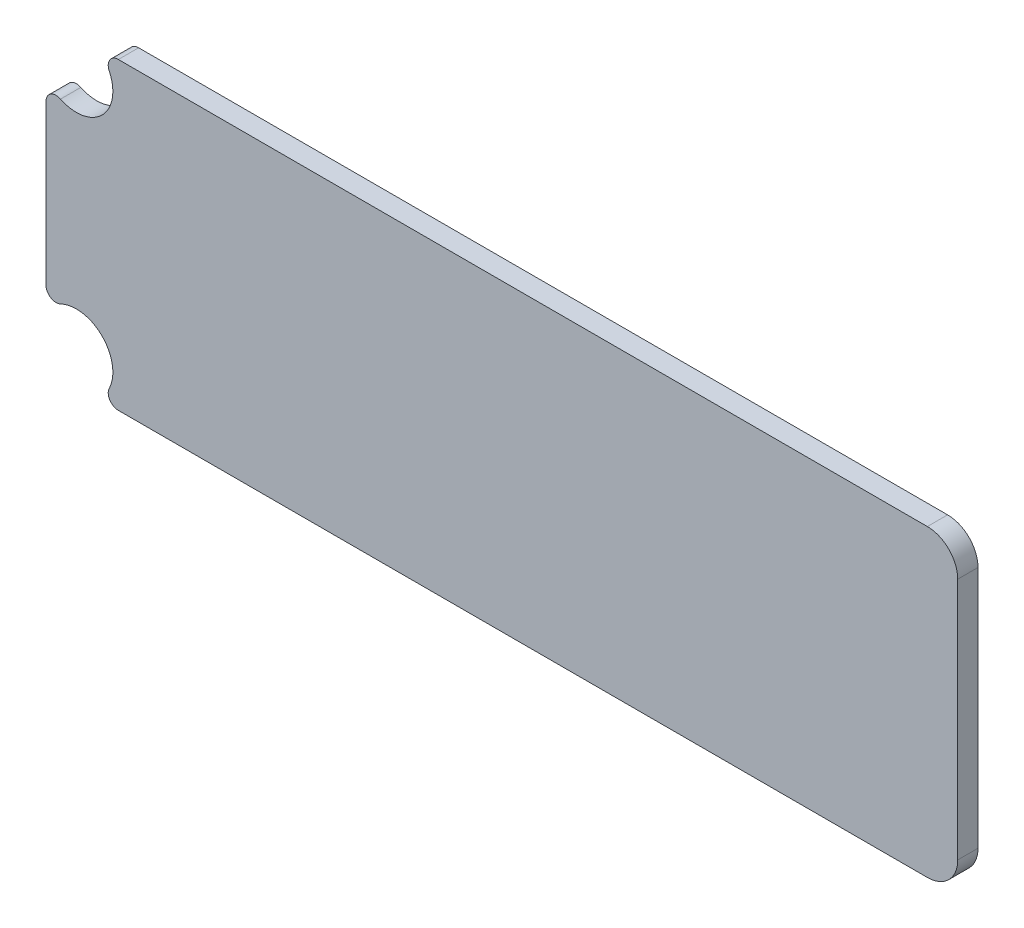
ISO-10303-21;
HEADER;
FILE_DESCRIPTION(('STEP AP214'),'2;1');
FILE_NAME('part.step','',(''),(''),'','','');
FILE_SCHEMA(('AUTOMOTIVE_DESIGN { 1 0 10303 214 1 1 1 1 }'));
ENDSEC;
DATA;
#1=APPLICATION_CONTEXT('core data for automotive mechanical design processes');
#2=APPLICATION_PROTOCOL_DEFINITION('international standard','automotive_design',2000,#1);
#3=PRODUCT_CONTEXT('',#1,'mechanical');
#4=PRODUCT('Part','Part','',(#3));
#5=PRODUCT_RELATED_PRODUCT_CATEGORY('part','',(#4));
#6=PRODUCT_DEFINITION_FORMATION('','',#4);
#7=PRODUCT_DEFINITION_CONTEXT('part definition',#1,'design');
#8=PRODUCT_DEFINITION('design','',#6,#7);
#9=PRODUCT_DEFINITION_SHAPE('','',#8);
#10=(LENGTH_UNIT() NAMED_UNIT(*) SI_UNIT(.MILLI.,.METRE.));
#11=(NAMED_UNIT(*) PLANE_ANGLE_UNIT() SI_UNIT($,.RADIAN.));
#12=(NAMED_UNIT(*) SI_UNIT($,.STERADIAN.) SOLID_ANGLE_UNIT());
#13=UNCERTAINTY_MEASURE_WITH_UNIT(LENGTH_MEASURE(1.E-05),#10,'distance_accuracy_value','');
#14=(GEOMETRIC_REPRESENTATION_CONTEXT(3) GLOBAL_UNCERTAINTY_ASSIGNED_CONTEXT((#13)) GLOBAL_UNIT_ASSIGNED_CONTEXT((#10,
#11,#12)) REPRESENTATION_CONTEXT('',''));
#15=CARTESIAN_POINT('',(0.,0.,0.));
#16=DIRECTION('',(0.,0.,1.));
#17=DIRECTION('',(1.,0.,0.));
#18=AXIS2_PLACEMENT_3D('',#15,#16,#17);
#19=CARTESIAN_POINT('',(-31.5826107403858,-31.9652184287217,0.));
#20=CARTESIAN_POINT('',(-31.7028294775423,-31.7162175913027,0.));
#21=CARTESIAN_POINT('',(-31.5558377960722,-31.4820223578383,0.));
#22=CARTESIAN_POINT('',(-31.408846114602,-31.2478271243739,0.));
#23=CARTESIAN_POINT('',(-31.1323430191422,-31.2478271243739,0.));
#24=CARTESIAN_POINT('',(-31.5826107403858,-31.9652184287217,1.));
#25=CARTESIAN_POINT('',(-31.7028294775423,-31.7162175913027,1.));
#26=CARTESIAN_POINT('',(-31.5558377960722,-31.4820223578383,1.));
#27=CARTESIAN_POINT('',(-31.408846114602,-31.2478271243739,1.));
#28=CARTESIAN_POINT('',(-31.1323430191422,-31.2478271243739,1.));
#29=(BOUNDED_SURFACE() B_SPLINE_SURFACE(1,2,((#19,#20,#21,#22,#23),(#24,#25,#26,#27,#28)),
.UNSPECIFIED.,.F.,.F.,.F.) B_SPLINE_SURFACE_WITH_KNOTS((2,2),(3,2,3),(0.,2.),
(-0.449796860424362,0.560499733185267,1.5707963267949),
.UNSPECIFIED.) GEOMETRIC_REPRESENTATION_ITEM() RATIONAL_B_SPLINE_SURFACE(((1.,0.875102717705526,
1.,0.875102717705526,1.),(1.,0.875102717705526,1.,0.875102717705526,1.))) REPRESENTATION_ITEM('') SURFACE());
#30=CARTESIAN_POINT('',(-31.1323430191422,-31.2478271243739,1.));
#31=CARTESIAN_POINT('',(-31.408846114602,-31.2478271243739,1.));
#32=CARTESIAN_POINT('',(-31.5558377960721,-31.4820223578382,1.));
#33=CARTESIAN_POINT('',(-31.7028294775423,-31.7162175913026,1.));
#34=CARTESIAN_POINT('',(-31.5826107403859,-31.9652184287216,1.));
#35=(BOUNDED_CURVE() B_SPLINE_CURVE(2,(#30,#31,#32,#33,#34),.UNSPECIFIED.,.F.,
.F.) B_SPLINE_CURVE_WITH_KNOTS((3,2,3),(0.,1.0102965936095,2.020593187219),
.UNSPECIFIED.) CURVE() GEOMETRIC_REPRESENTATION_ITEM() RATIONAL_B_SPLINE_CURVE((1.,
0.875102717705541,1.,0.875102717705571,1.)) REPRESENTATION_ITEM(''));
#36=CARTESIAN_POINT('',(-31.1323430191422,-31.2478271243739,1.));
#37=VERTEX_POINT('',#36);
#38=CARTESIAN_POINT('',(-31.5826107403859,-31.9652184287216,1.));
#39=VERTEX_POINT('',#38);
#40=EDGE_CURVE('E183',#37,#39,#35,.T.);
#41=CARTESIAN_POINT('',(-31.1323430191422,-31.2478271243739,1.));
#42=CARTESIAN_POINT('',(-31.1323430191422,-31.2478271243739,0.));
#43=(BOUNDED_CURVE() B_SPLINE_CURVE(1,(#41,#42),.UNSPECIFIED.,.F.,
.F.) B_SPLINE_CURVE_WITH_KNOTS((2,2),(0.,1.),
.UNSPECIFIED.) CURVE() GEOMETRIC_REPRESENTATION_ITEM() RATIONAL_B_SPLINE_CURVE((1.,1.)) REPRESENTATION_ITEM(''));
#44=CARTESIAN_POINT('',(-31.1323430191422,-31.2478271243739,0.));
#45=VERTEX_POINT('',#44);
#46=EDGE_CURVE('E108',#37,#45,#43,.T.);
#47=CARTESIAN_POINT('',(-31.5826107403859,-31.9652184287217,0.));
#48=CARTESIAN_POINT('',(-31.7028294775423,-31.7162175913027,0.));
#49=CARTESIAN_POINT('',(-31.5558377960722,-31.4820223578383,0.));
#50=CARTESIAN_POINT('',(-31.408846114602,-31.2478271243739,0.));
#51=CARTESIAN_POINT('',(-31.1323430191422,-31.2478271243739,0.));
#52=(BOUNDED_CURVE() B_SPLINE_CURVE(2,(#47,#48,#49,#50,#51),.UNSPECIFIED.,.F.,
.F.) B_SPLINE_CURVE_WITH_KNOTS((3,2,3),(-4.22405166400351E-13,1.0102965936092,2.02059318721883),
.UNSPECIFIED.) CURVE() GEOMETRIC_REPRESENTATION_ITEM() RATIONAL_B_SPLINE_CURVE((1.,
0.875102717705435,1.,0.875102717705573,1.)) REPRESENTATION_ITEM(''));
#53=CARTESIAN_POINT('',(-31.5826107403858,-31.9652184287217,0.));
#54=VERTEX_POINT('',#53);
#55=EDGE_CURVE('E107',#54,#45,#52,.T.);
#56=CARTESIAN_POINT('',(-31.5826107403858,-31.9652184287217,0.));
#57=CARTESIAN_POINT('',(-31.5826107403858,-31.9652184287217,1.));
#58=(BOUNDED_CURVE() B_SPLINE_CURVE(1,(#56,#57),.UNSPECIFIED.,.F.,
.F.) B_SPLINE_CURVE_WITH_KNOTS((2,2),(0.,1.),
.UNSPECIFIED.) CURVE() GEOMETRIC_REPRESENTATION_ITEM() RATIONAL_B_SPLINE_CURVE((1.,1.)) REPRESENTATION_ITEM(''));
#59=EDGE_CURVE('E11',#54,#39,#58,.T.);
#60=ORIENTED_EDGE('',*,*,#40,.F.);
#61=ORIENTED_EDGE('',*,*,#46,.T.);
#62=ORIENTED_EDGE('',*,*,#55,.F.);
#63=ORIENTED_EDGE('',*,*,#59,.T.);
#64=EDGE_LOOP('',(#60,#61,#62,#63));
#65=FACE_BOUND('',#64,.T.);
#66=ADVANCED_FACE('F17',(#65),#29,.T.);
#67=CARTESIAN_POINT('',(-31.5826107403859,-31.9652184287216,1.));
#68=CARTESIAN_POINT('',(-31.0267329755231,-33.1165699753055,1.));
#69=CARTESIAN_POINT('',(-31.9307823307271,-34.0206193305096,1.));
#70=CARTESIAN_POINT('',(-32.8348316859312,-34.9246686857138,1.));
#71=CARTESIAN_POINT('',(-33.9861832325151,-34.3687909208511,1.));
#72=CARTESIAN_POINT('',(-31.5826107403859,-31.9652184287216,0.));
#73=CARTESIAN_POINT('',(-31.0267329755231,-33.1165699753055,0.));
#74=CARTESIAN_POINT('',(-31.9307823307271,-34.0206193305096,0.));
#75=CARTESIAN_POINT('',(-32.8348316859312,-34.9246686857138,0.));
#76=CARTESIAN_POINT('',(-33.9861832325151,-34.3687909208511,0.));
#77=(BOUNDED_SURFACE() B_SPLINE_SURFACE(1,2,((#67,#68,#69,#70,#71),(#72,#73,#74,#75,#76)),
.UNSPECIFIED.,.F.,.F.,.F.) B_SPLINE_SURFACE_WITH_KNOTS((2,2),(3,2,3),(0.,0.555555555555555),
(2.69179579316536,3.92699081698718,5.162185840809),
.UNSPECIFIED.) GEOMETRIC_REPRESENTATION_ITEM() RATIONAL_B_SPLINE_SURFACE(((1.,0.815272036540846,
1.,0.815272036540846,1.),(1.,0.815272036540846,1.,0.815272036540846,1.))) REPRESENTATION_ITEM('') SURFACE());
#78=CARTESIAN_POINT('',(-33.9861832325151,-34.3687909208511,0.));
#79=CARTESIAN_POINT('',(-32.8348316859312,-34.9246686857137,0.));
#80=CARTESIAN_POINT('',(-31.9307823307272,-34.0206193305097,0.));
#81=CARTESIAN_POINT('',(-31.0267329755231,-33.1165699753056,0.));
#82=CARTESIAN_POINT('',(-31.5826107403859,-31.9652184287217,0.));
#83=(BOUNDED_CURVE() B_SPLINE_CURVE(2,(#78,#79,#80,#81,#82),.UNSPECIFIED.,.F.,
.F.) B_SPLINE_CURVE_WITH_KNOTS((3,2,3),(-1.03708622622441E-13,1.23519502382168,
2.47039004764346),
.UNSPECIFIED.) CURVE() GEOMETRIC_REPRESENTATION_ITEM() RATIONAL_B_SPLINE_CURVE((1.,
0.815272036540861,1.,0.815272036540857,1.)) REPRESENTATION_ITEM(''));
#84=CARTESIAN_POINT('',(-33.9861832325151,-34.3687909208511,0.));
#85=VERTEX_POINT('',#84);
#86=EDGE_CURVE('E99',#85,#54,#83,.T.);
#87=CARTESIAN_POINT('',(-33.9861832325151,-34.3687909208511,0.));
#88=CARTESIAN_POINT('',(-33.9861832325151,-34.3687909208511,1.));
#89=(BOUNDED_CURVE() B_SPLINE_CURVE(1,(#87,#88),.UNSPECIFIED.,.F.,
.F.) B_SPLINE_CURVE_WITH_KNOTS((2,2),(0.,1.),
.UNSPECIFIED.) CURVE() GEOMETRIC_REPRESENTATION_ITEM() RATIONAL_B_SPLINE_CURVE((1.,1.)) REPRESENTATION_ITEM(''));
#90=CARTESIAN_POINT('',(-33.986183232515,-34.3687909208511,1.));
#91=VERTEX_POINT('',#90);
#92=EDGE_CURVE('E32',#85,#91,#89,.T.);
#93=CARTESIAN_POINT('',(-31.5826107403859,-31.9652184287216,1.));
#94=CARTESIAN_POINT('',(-31.0267329755231,-33.1165699753054,1.));
#95=CARTESIAN_POINT('',(-31.9307823307271,-34.0206193305096,1.));
#96=CARTESIAN_POINT('',(-32.8348316859311,-34.9246686857137,1.));
#97=CARTESIAN_POINT('',(-33.986183232515,-34.3687909208511,1.));
#98=(BOUNDED_CURVE() B_SPLINE_CURVE(2,(#93,#94,#95,#96,#97),.UNSPECIFIED.,.F.,
.F.) B_SPLINE_CURVE_WITH_KNOTS((3,2,3),(0.,1.23519502382184,2.47039004764363),
.UNSPECIFIED.) CURVE() GEOMETRIC_REPRESENTATION_ITEM() RATIONAL_B_SPLINE_CURVE((1.,
0.815272036540853,1.,0.815272036540864,1.)) REPRESENTATION_ITEM(''));
#99=EDGE_CURVE('E102',#39,#91,#98,.T.);
#100=ORIENTED_EDGE('',*,*,#86,.F.);
#101=ORIENTED_EDGE('',*,*,#92,.T.);
#102=ORIENTED_EDGE('',*,*,#99,.F.);
#103=ORIENTED_EDGE('',*,*,#59,.F.);
#104=EDGE_LOOP('',(#100,#101,#102,#103));
#105=FACE_BOUND('',#104,.T.);
#106=ADVANCED_FACE('F19',(#105),#77,.T.);
#107=CARTESIAN_POINT('',(-34.703574536863,-34.8190586420947,0.));
#108=CARTESIAN_POINT('',(-34.703574536863,-34.5425555466348,0.));
#109=CARTESIAN_POINT('',(-34.4693793033985,-34.3955638651647,0.));
#110=CARTESIAN_POINT('',(-34.235184069934,-34.2485721836946,0.));
#111=CARTESIAN_POINT('',(-33.986183232515,-34.3687909208511,0.));
#112=CARTESIAN_POINT('',(-34.703574536863,-34.8190586420947,1.));
#113=CARTESIAN_POINT('',(-34.703574536863,-34.5425555466348,1.));
#114=CARTESIAN_POINT('',(-34.4693793033985,-34.3955638651647,1.));
#115=CARTESIAN_POINT('',(-34.235184069934,-34.2485721836946,1.));
#116=CARTESIAN_POINT('',(-33.986183232515,-34.3687909208511,1.));
#117=(BOUNDED_SURFACE() B_SPLINE_SURFACE(1,2,((#107,#108,#109,#110,#111),(#112,#113,#114,#115,
#116)),.UNSPECIFIED.,.F.,.F.,.F.) B_SPLINE_SURFACE_WITH_KNOTS((2,2),(3,2,3),(0.,2.),(0.,
1.0102965936098,2.0205931872196),
.UNSPECIFIED.) GEOMETRIC_REPRESENTATION_ITEM() RATIONAL_B_SPLINE_SURFACE(((1.,0.875102717705484,
1.,0.875102717705484,1.),(1.,0.875102717705484,1.,0.875102717705484,1.))) REPRESENTATION_ITEM('') SURFACE());
#118=CARTESIAN_POINT('',(-34.703574536863,-34.8190586420947,0.));
#119=CARTESIAN_POINT('',(-34.703574536863,-34.5425555466349,0.));
#120=CARTESIAN_POINT('',(-34.4693793033986,-34.3955638651647,0.));
#121=CARTESIAN_POINT('',(-34.2351840699341,-34.2485721836946,0.));
#122=CARTESIAN_POINT('',(-33.9861832325151,-34.3687909208511,0.));
#123=(BOUNDED_CURVE() B_SPLINE_CURVE(2,(#118,#119,#120,#121,#122),.UNSPECIFIED.,.F.,
.F.) B_SPLINE_CURVE_WITH_KNOTS((3,2,3),(0.,1.01029659360971,2.02059318721943),
.UNSPECIFIED.) CURVE() GEOMETRIC_REPRESENTATION_ITEM() RATIONAL_B_SPLINE_CURVE((1.,
0.875102717705579,1.,0.875102717705511,1.)) REPRESENTATION_ITEM(''));
#124=CARTESIAN_POINT('',(-34.703574536863,-34.8190586420947,0.));
#125=VERTEX_POINT('',#124);
#126=EDGE_CURVE('E119',#125,#85,#123,.T.);
#127=CARTESIAN_POINT('',(-34.703574536863,-34.8190586420947,0.));
#128=CARTESIAN_POINT('',(-34.703574536863,-34.8190586420947,1.));
#129=(BOUNDED_CURVE() B_SPLINE_CURVE(1,(#127,#128),.UNSPECIFIED.,.F.,
.F.) B_SPLINE_CURVE_WITH_KNOTS((2,2),(0.,1.),
.UNSPECIFIED.) CURVE() GEOMETRIC_REPRESENTATION_ITEM() RATIONAL_B_SPLINE_CURVE((1.,1.)) REPRESENTATION_ITEM(''));
#130=CARTESIAN_POINT('',(-34.703574536863,-34.8190586420947,1.));
#131=VERTEX_POINT('',#130);
#132=EDGE_CURVE('E164',#125,#131,#129,.T.);
#133=CARTESIAN_POINT('',(-33.986183232515,-34.3687909208511,1.));
#134=CARTESIAN_POINT('',(-34.235184069934,-34.2485721836946,1.));
#135=CARTESIAN_POINT('',(-34.4693793033985,-34.3955638651647,1.));
#136=CARTESIAN_POINT('',(-34.703574536863,-34.5425555466348,1.));
#137=CARTESIAN_POINT('',(-34.703574536863,-34.8190586420947,1.));
#138=(BOUNDED_CURVE() B_SPLINE_CURVE(2,(#133,#134,#135,#136,#137),.UNSPECIFIED.,.F.,
.F.) B_SPLINE_CURVE_WITH_KNOTS((3,2,3),(2.07039246857831E-13,1.01029659361001,2.02059318721981),
.UNSPECIFIED.) CURVE() GEOMETRIC_REPRESENTATION_ITEM() RATIONAL_B_SPLINE_CURVE((1.,
0.875102717705507,1.,0.87510271770551,1.)) REPRESENTATION_ITEM(''));
#139=EDGE_CURVE('E313',#91,#131,#138,.T.);
#140=ORIENTED_EDGE('',*,*,#126,.F.);
#141=ORIENTED_EDGE('',*,*,#132,.T.);
#142=ORIENTED_EDGE('',*,*,#139,.F.);
#143=ORIENTED_EDGE('',*,*,#92,.F.);
#144=EDGE_LOOP('',(#140,#141,#142,#143));
#145=FACE_BOUND('',#144,.T.);
#146=ADVANCED_FACE('F353',(#145),#117,.T.);
#147=CARTESIAN_POINT('',(-34.703574536863,-42.6775956066531,-0.00099999999999989));
#148=CARTESIAN_POINT('',(-34.703574536863,-34.8180586420947,-0.00099999999999989));
#149=CARTESIAN_POINT('',(-34.703574536863,-42.6775956066531,1.001));
#150=CARTESIAN_POINT('',(-34.703574536863,-34.8180586420947,1.001));
#151=(BOUNDED_SURFACE() B_SPLINE_SURFACE(1,1,((#147,#148),(#149,#150)),.UNSPECIFIED.,.F.,.F.,
.F.) B_SPLINE_SURFACE_WITH_KNOTS((2,2),(2,2),(-0.001,1.001),(-0.001,7.85853696455841),
.UNSPECIFIED.) GEOMETRIC_REPRESENTATION_ITEM() RATIONAL_B_SPLINE_SURFACE(((1.,1.),(1.,1.))) REPRESENTATION_ITEM('') SURFACE());
#152=CARTESIAN_POINT('',(-34.703574536863,-42.6765956066531,0.));
#153=CARTESIAN_POINT('',(-34.703574536863,-34.8190586420947,0.));
#154=(BOUNDED_CURVE() B_SPLINE_CURVE(1,(#152,#153),.UNSPECIFIED.,.F.,
.F.) B_SPLINE_CURVE_WITH_KNOTS((2,2),(0.,7.8575369645584),
.UNSPECIFIED.) CURVE() GEOMETRIC_REPRESENTATION_ITEM() RATIONAL_B_SPLINE_CURVE((1.,1.)) REPRESENTATION_ITEM(''));
#155=CARTESIAN_POINT('',(-34.703574536863,-42.6765956066531,0.));
#156=VERTEX_POINT('',#155);
#157=EDGE_CURVE('E126',#156,#125,#154,.T.);
#158=CARTESIAN_POINT('',(-34.703574536863,-42.6765956066531,1.));
#159=CARTESIAN_POINT('',(-34.703574536863,-42.6765956066531,0.));
#160=(BOUNDED_CURVE() B_SPLINE_CURVE(1,(#158,#159),.UNSPECIFIED.,.F.,
.F.) B_SPLINE_CURVE_WITH_KNOTS((2,2),(0.,1.),
.UNSPECIFIED.) CURVE() GEOMETRIC_REPRESENTATION_ITEM() RATIONAL_B_SPLINE_CURVE((1.,1.)) REPRESENTATION_ITEM(''));
#161=CARTESIAN_POINT('',(-34.703574536863,-42.6765956066531,1.));
#162=VERTEX_POINT('',#161);
#163=EDGE_CURVE('E173',#162,#156,#160,.T.);
#164=CARTESIAN_POINT('',(-34.703574536863,-42.6765956066531,1.));
#165=CARTESIAN_POINT('',(-34.703574536863,-34.8190586420947,1.));
#166=(BOUNDED_CURVE() B_SPLINE_CURVE(1,(#164,#165),.UNSPECIFIED.,.F.,
.F.) B_SPLINE_CURVE_WITH_KNOTS((2,2),(0.,7.8575369645584),
.UNSPECIFIED.) CURVE() GEOMETRIC_REPRESENTATION_ITEM() RATIONAL_B_SPLINE_CURVE((1.,1.)) REPRESENTATION_ITEM(''));
#167=EDGE_CURVE('E287',#162,#131,#166,.T.);
#168=ORIENTED_EDGE('',*,*,#157,.F.);
#169=ORIENTED_EDGE('',*,*,#163,.F.);
#170=ORIENTED_EDGE('',*,*,#167,.T.);
#171=ORIENTED_EDGE('',*,*,#132,.F.);
#172=EDGE_LOOP('',(#168,#169,#170,#171));
#173=FACE_BOUND('',#172,.T.);
#174=ADVANCED_FACE('F481',(#173),#151,.T.);
#175=CARTESIAN_POINT('',(-33.9861832325151,-43.1268633278967,0.));
#176=CARTESIAN_POINT('',(-34.2351840699342,-43.2470820650532,0.));
#177=CARTESIAN_POINT('',(-34.4693793033986,-43.1000903835831,0.));
#178=CARTESIAN_POINT('',(-34.703574536863,-42.9530987021129,0.));
#179=CARTESIAN_POINT('',(-34.703574536863,-42.6765956066531,0.));
#180=CARTESIAN_POINT('',(-33.9861832325151,-43.1268633278967,1.));
#181=CARTESIAN_POINT('',(-34.2351840699342,-43.2470820650532,1.));
#182=CARTESIAN_POINT('',(-34.4693793033986,-43.1000903835831,1.));
#183=CARTESIAN_POINT('',(-34.703574536863,-42.9530987021129,1.));
#184=CARTESIAN_POINT('',(-34.703574536863,-42.6765956066531,1.));
#185=(BOUNDED_SURFACE() B_SPLINE_SURFACE(1,2,((#175,#176,#177,#178,#179),(#180,#181,#182,#183,
#184)),.UNSPECIFIED.,.F.,.F.,.F.) B_SPLINE_SURFACE_WITH_KNOTS((2,2),(3,2,3),(0.,2.),
(-2.02059318721935,-1.01029659360967,0.),
.UNSPECIFIED.) GEOMETRIC_REPRESENTATION_ITEM() RATIONAL_B_SPLINE_SURFACE(((1.,0.875102717705514,
1.,0.875102717705514,1.),(1.,0.875102717705514,1.,0.875102717705514,1.))) REPRESENTATION_ITEM('') SURFACE());
#186=CARTESIAN_POINT('',(-33.9861832325151,-43.1268633278967,0.));
#187=CARTESIAN_POINT('',(-34.2351840699342,-43.2470820650532,0.));
#188=CARTESIAN_POINT('',(-34.4693793033986,-43.1000903835831,0.));
#189=CARTESIAN_POINT('',(-34.703574536863,-42.9530987021129,0.));
#190=CARTESIAN_POINT('',(-34.703574536863,-42.6765956066531,0.));
#191=(BOUNDED_CURVE() B_SPLINE_CURVE(2,(#186,#187,#188,#189,#190),.UNSPECIFIED.,.F.,
.F.) B_SPLINE_CURVE_WITH_KNOTS((3,2,3),(0.,1.0102965936096,2.02059318721927),
.UNSPECIFIED.) CURVE() GEOMETRIC_REPRESENTATION_ITEM() RATIONAL_B_SPLINE_CURVE((1.,
0.875102717705393,1.,0.875102717705527,1.)) REPRESENTATION_ITEM(''));
#192=CARTESIAN_POINT('',(-33.9861832325151,-43.1268633278968,0.));
#193=VERTEX_POINT('',#192);
#194=EDGE_CURVE('E203',#193,#156,#191,.T.);
#195=CARTESIAN_POINT('',(-33.9861832325151,-43.1268633278968,0.));
#196=CARTESIAN_POINT('',(-33.9861832325151,-43.1268633278968,1.));
#197=(BOUNDED_CURVE() B_SPLINE_CURVE(1,(#195,#196),.UNSPECIFIED.,.F.,
.F.) B_SPLINE_CURVE_WITH_KNOTS((2,2),(0.,1.),
.UNSPECIFIED.) CURVE() GEOMETRIC_REPRESENTATION_ITEM() RATIONAL_B_SPLINE_CURVE((1.,1.)) REPRESENTATION_ITEM(''));
#198=CARTESIAN_POINT('',(-33.9861832325151,-43.1268633278968,1.));
#199=VERTEX_POINT('',#198);
#200=EDGE_CURVE('E254',#193,#199,#197,.T.);
#201=CARTESIAN_POINT('',(-34.703574536863,-42.6765956066531,1.));
#202=CARTESIAN_POINT('',(-34.703574536863,-42.9530987021129,1.));
#203=CARTESIAN_POINT('',(-34.4693793033986,-43.1000903835831,1.));
#204=CARTESIAN_POINT('',(-34.2351840699342,-43.2470820650532,1.));
#205=CARTESIAN_POINT('',(-33.9861832325151,-43.1268633278967,1.));
#206=(BOUNDED_CURVE() B_SPLINE_CURVE(2,(#201,#202,#203,#204,#205),.UNSPECIFIED.,.F.,
.F.) B_SPLINE_CURVE_WITH_KNOTS((3,2,3),(0.,1.01029659360967,2.02059318721934),
.UNSPECIFIED.) CURVE() GEOMETRIC_REPRESENTATION_ITEM() RATIONAL_B_SPLINE_CURVE((1.,
0.875102717705527,1.,0.875102717705393,1.)) REPRESENTATION_ITEM(''));
#207=EDGE_CURVE('E23',#162,#199,#206,.T.);
#208=ORIENTED_EDGE('',*,*,#194,.F.);
#209=ORIENTED_EDGE('',*,*,#200,.T.);
#210=ORIENTED_EDGE('',*,*,#207,.F.);
#211=ORIENTED_EDGE('',*,*,#163,.T.);
#212=EDGE_LOOP('',(#208,#209,#210,#211));
#213=FACE_BOUND('',#212,.T.);
#214=ADVANCED_FACE('F538',(#213),#185,.T.);
#215=CARTESIAN_POINT('',(-33.9861832325151,-43.1268633278967,1.));
#216=CARTESIAN_POINT('',(-32.8348316859313,-42.570985563034,1.));
#217=CARTESIAN_POINT('',(-31.9307823307272,-43.4750349182381,1.));
#218=CARTESIAN_POINT('',(-31.0267329755231,-44.3790842734422,1.));
#219=CARTESIAN_POINT('',(-31.5826107403859,-45.5304358200261,1.));
#220=CARTESIAN_POINT('',(-33.9861832325151,-43.1268633278967,0.));
#221=CARTESIAN_POINT('',(-32.8348316859313,-42.570985563034,0.));
#222=CARTESIAN_POINT('',(-31.9307823307272,-43.4750349182381,0.));
#223=CARTESIAN_POINT('',(-31.0267329755231,-44.3790842734422,0.));
#224=CARTESIAN_POINT('',(-31.5826107403859,-45.5304358200261,0.));
#225=(BOUNDED_SURFACE() B_SPLINE_SURFACE(1,2,((#215,#216,#217,#218,#219),(#220,#221,#222,#223,
#224)),.UNSPECIFIED.,.F.,.F.,.F.) B_SPLINE_SURFACE_WITH_KNOTS((2,2),(3,2,3),(0.,
0.555555555555555),(1.12099946637056,2.35619449019236,3.59138951401415),
.UNSPECIFIED.) GEOMETRIC_REPRESENTATION_ITEM() RATIONAL_B_SPLINE_SURFACE(((1.,0.815272036540853,
1.,0.815272036540853,1.),(1.,0.815272036540853,1.,0.815272036540853,1.))) REPRESENTATION_ITEM('') SURFACE());
#226=CARTESIAN_POINT('',(-31.5826107403859,-45.5304358200261,0.));
#227=CARTESIAN_POINT('',(-31.0267329755231,-44.3790842734422,0.));
#228=CARTESIAN_POINT('',(-31.9307823307272,-43.4750349182381,0.));
#229=CARTESIAN_POINT('',(-32.8348316859313,-42.570985563034,0.));
#230=CARTESIAN_POINT('',(-33.9861832325151,-43.1268633278967,0.));
#231=(BOUNDED_CURVE() B_SPLINE_CURVE(2,(#226,#227,#228,#229,#230),.UNSPECIFIED.,.F.,
.F.) B_SPLINE_CURVE_WITH_KNOTS((3,2,3),(0.,1.23519502382183,2.47039004764362),
.UNSPECIFIED.) CURVE() GEOMETRIC_REPRESENTATION_ITEM() RATIONAL_B_SPLINE_CURVE((1.,
0.815272036540851,1.,0.815272036540835,1.)) REPRESENTATION_ITEM(''));
#232=CARTESIAN_POINT('',(-31.5826107403858,-45.5304358200261,0.));
#233=VERTEX_POINT('',#232);
#234=EDGE_CURVE('E194',#233,#193,#231,.T.);
#235=CARTESIAN_POINT('',(-31.5826107403858,-45.5304358200261,0.));
#236=CARTESIAN_POINT('',(-31.5826107403858,-45.5304358200261,1.));
#237=(BOUNDED_CURVE() B_SPLINE_CURVE(1,(#235,#236),.UNSPECIFIED.,.F.,
.F.) B_SPLINE_CURVE_WITH_KNOTS((2,2),(0.,1.),
.UNSPECIFIED.) CURVE() GEOMETRIC_REPRESENTATION_ITEM() RATIONAL_B_SPLINE_CURVE((1.,1.)) REPRESENTATION_ITEM(''));
#238=CARTESIAN_POINT('',(-31.5826107403858,-45.5304358200261,1.));
#239=VERTEX_POINT('',#238);
#240=EDGE_CURVE('E40',#233,#239,#237,.T.);
#241=CARTESIAN_POINT('',(-33.9861832325151,-43.1268633278967,1.));
#242=CARTESIAN_POINT('',(-32.8348316859313,-42.570985563034,1.));
#243=CARTESIAN_POINT('',(-31.9307823307272,-43.4750349182381,1.));
#244=CARTESIAN_POINT('',(-31.0267329755231,-44.3790842734422,1.));
#245=CARTESIAN_POINT('',(-31.5826107403859,-45.5304358200261,1.));
#246=(BOUNDED_CURVE() B_SPLINE_CURVE(2,(#241,#242,#243,#244,#245),.UNSPECIFIED.,.F.,
.F.) B_SPLINE_CURVE_WITH_KNOTS((3,2,3),(0.,1.23519502382181,2.47039004764361),
.UNSPECIFIED.) CURVE() GEOMETRIC_REPRESENTATION_ITEM() RATIONAL_B_SPLINE_CURVE((1.,
0.81527203654083,1.,0.815272036540845,1.)) REPRESENTATION_ITEM(''));
#247=EDGE_CURVE('E270',#199,#239,#246,.T.);
#248=ORIENTED_EDGE('',*,*,#234,.F.);
#249=ORIENTED_EDGE('',*,*,#240,.T.);
#250=ORIENTED_EDGE('',*,*,#247,.F.);
#251=ORIENTED_EDGE('',*,*,#200,.F.);
#252=EDGE_LOOP('',(#248,#249,#250,#251));
#253=FACE_BOUND('',#252,.T.);
#254=ADVANCED_FACE('F502',(#253),#225,.T.);
#255=CARTESIAN_POINT('',(-31.1333430191422,-31.2478271243739,-0.00099999999999989));
#256=CARTESIAN_POINT('',(8.79742546313702,-31.2478271243739,-0.00099999999999989));
#257=CARTESIAN_POINT('',(-31.1333430191422,-31.2478271243739,1.001));
#258=CARTESIAN_POINT('',(8.79742546313702,-31.2478271243739,1.001));
#259=(BOUNDED_SURFACE() B_SPLINE_SURFACE(1,1,((#255,#256),(#257,#258)),.UNSPECIFIED.,.F.,.F.,
.F.) B_SPLINE_SURFACE_WITH_KNOTS((2,2),(2,2),(-0.001,1.001),(-0.001,39.9297684822792),
.UNSPECIFIED.) GEOMETRIC_REPRESENTATION_ITEM() RATIONAL_B_SPLINE_SURFACE(((1.,1.),(1.,1.))) REPRESENTATION_ITEM('') SURFACE());
#260=CARTESIAN_POINT('',(-31.1323430191422,-31.2478271243739,0.));
#261=CARTESIAN_POINT('',(8.79642546313702,-31.2478271243739,0.));
#262=(BOUNDED_CURVE() B_SPLINE_CURVE(1,(#260,#261),.UNSPECIFIED.,.F.,
.F.) B_SPLINE_CURVE_WITH_KNOTS((2,2),(0.,39.9287684822792),
.UNSPECIFIED.) CURVE() GEOMETRIC_REPRESENTATION_ITEM() RATIONAL_B_SPLINE_CURVE((1.,1.)) REPRESENTATION_ITEM(''));
#263=CARTESIAN_POINT('',(8.79642546313702,-31.2478271243739,0.));
#264=VERTEX_POINT('',#263);
#265=EDGE_CURVE('E113',#45,#264,#262,.T.);
#266=CARTESIAN_POINT('',(-31.1323430191422,-31.2478271243739,1.));
#267=CARTESIAN_POINT('',(8.79642546313702,-31.2478271243739,1.));
#268=(BOUNDED_CURVE() B_SPLINE_CURVE(1,(#266,#267),.UNSPECIFIED.,.F.,
.F.) B_SPLINE_CURVE_WITH_KNOTS((2,2),(0.,39.9287684822792),
.UNSPECIFIED.) CURVE() GEOMETRIC_REPRESENTATION_ITEM() RATIONAL_B_SPLINE_CURVE((1.,1.)) REPRESENTATION_ITEM(''));
#269=CARTESIAN_POINT('',(8.79642546313702,-31.2478271243739,1.));
#270=VERTEX_POINT('',#269);
#271=EDGE_CURVE('E174',#37,#270,#268,.T.);
#272=CARTESIAN_POINT('',(8.79642546313702,-31.2478271243739,0.));
#273=CARTESIAN_POINT('',(8.79642546313702,-31.2478271243739,1.));
#274=(BOUNDED_CURVE() B_SPLINE_CURVE(1,(#272,#273),.UNSPECIFIED.,.F.,
.F.) B_SPLINE_CURVE_WITH_KNOTS((2,2),(0.,1.),
.UNSPECIFIED.) CURVE() GEOMETRIC_REPRESENTATION_ITEM() RATIONAL_B_SPLINE_CURVE((1.,1.)) REPRESENTATION_ITEM(''));
#275=EDGE_CURVE('E147',#264,#270,#274,.T.);
#276=ORIENTED_EDGE('',*,*,#265,.F.);
#277=ORIENTED_EDGE('',*,*,#46,.F.);
#278=ORIENTED_EDGE('',*,*,#271,.T.);
#279=ORIENTED_EDGE('',*,*,#275,.F.);
#280=EDGE_LOOP('',(#276,#277,#278,#279));
#281=FACE_BOUND('',#280,.T.);
#282=ADVANCED_FACE('F361',(#281),#259,.T.);
#283=CARTESIAN_POINT('',(-31.1323430191422,-46.2478271243739,0.));
#284=CARTESIAN_POINT('',(-31.408846114602,-46.2478271243739,0.));
#285=CARTESIAN_POINT('',(-31.5558377960722,-46.0136318909095,0.));
#286=CARTESIAN_POINT('',(-31.7028294775423,-45.7794366574451,0.));
#287=CARTESIAN_POINT('',(-31.5826107403859,-45.5304358200261,0.));
#288=CARTESIAN_POINT('',(-31.1323430191422,-46.2478271243739,1.));
#289=CARTESIAN_POINT('',(-31.408846114602,-46.2478271243739,1.));
#290=CARTESIAN_POINT('',(-31.5558377960722,-46.0136318909095,1.));
#291=CARTESIAN_POINT('',(-31.7028294775423,-45.7794366574451,1.));
#292=CARTESIAN_POINT('',(-31.5826107403859,-45.5304358200261,1.));
#293=(BOUNDED_SURFACE() B_SPLINE_SURFACE(1,2,((#283,#284,#285,#286,#287),(#288,#289,#290,#291,
#292)),.UNSPECIFIED.,.F.,.F.,.F.) B_SPLINE_SURFACE_WITH_KNOTS((2,2),(3,2,3),(0.,2.),
(-1.5707963267949,-0.560499733185273,0.44979686042435),
.UNSPECIFIED.) GEOMETRIC_REPRESENTATION_ITEM() RATIONAL_B_SPLINE_SURFACE(((1.,0.875102717705527,
1.,0.875102717705527,1.),(1.,0.875102717705527,1.,0.875102717705527,1.))) REPRESENTATION_ITEM('') SURFACE());
#294=CARTESIAN_POINT('',(-31.5826107403859,-45.5304358200261,1.));
#295=CARTESIAN_POINT('',(-31.7028294775423,-45.7794366574451,1.));
#296=CARTESIAN_POINT('',(-31.5558377960722,-46.0136318909095,1.));
#297=CARTESIAN_POINT('',(-31.408846114602,-46.2478271243739,1.));
#298=CARTESIAN_POINT('',(-31.1323430191422,-46.2478271243739,1.));
#299=(BOUNDED_CURVE() B_SPLINE_CURVE(2,(#294,#295,#296,#297,#298),.UNSPECIFIED.,.F.,
.F.) B_SPLINE_CURVE_WITH_KNOTS((3,2,3),(-1.15619319673854E-13,1.01029659360951,
2.02059318721913),
.UNSPECIFIED.) CURVE() GEOMETRIC_REPRESENTATION_ITEM() RATIONAL_B_SPLINE_CURVE((1.,
0.875102717705429,1.,0.875102717705489,1.)) REPRESENTATION_ITEM(''));
#300=CARTESIAN_POINT('',(-31.1323430191422,-46.2478271243739,1.));
#301=VERTEX_POINT('',#300);
#302=EDGE_CURVE('E262',#239,#301,#299,.T.);
#303=CARTESIAN_POINT('',(-31.1323430191422,-46.2478271243739,0.));
#304=CARTESIAN_POINT('',(-31.408846114602,-46.2478271243739,0.));
#305=CARTESIAN_POINT('',(-31.5558377960722,-46.0136318909095,0.));
#306=CARTESIAN_POINT('',(-31.7028294775423,-45.7794366574451,0.));
#307=CARTESIAN_POINT('',(-31.5826107403859,-45.5304358200261,0.));
#308=(BOUNDED_CURVE() B_SPLINE_CURVE(2,(#303,#304,#305,#306,#307),.UNSPECIFIED.,.F.,
.F.) B_SPLINE_CURVE_WITH_KNOTS((3,2,3),(0.,1.01029659360963,2.02059318721925),
.UNSPECIFIED.) CURVE() GEOMETRIC_REPRESENTATION_ITEM() RATIONAL_B_SPLINE_CURVE((1.,
0.875102717705489,1.,0.875102717705429,1.)) REPRESENTATION_ITEM(''));
#309=CARTESIAN_POINT('',(-31.1323430191422,-46.2478271243739,0.));
#310=VERTEX_POINT('',#309);
#311=EDGE_CURVE('E204',#310,#233,#308,.T.);
#312=CARTESIAN_POINT('',(-31.1323430191422,-46.2478271243739,0.));
#313=CARTESIAN_POINT('',(-31.1323430191422,-46.2478271243739,1.));
#314=(BOUNDED_CURVE() B_SPLINE_CURVE(1,(#312,#313),.UNSPECIFIED.,.F.,
.F.) B_SPLINE_CURVE_WITH_KNOTS((2,2),(0.,1.),
.UNSPECIFIED.) CURVE() GEOMETRIC_REPRESENTATION_ITEM() RATIONAL_B_SPLINE_CURVE((1.,1.)) REPRESENTATION_ITEM(''));
#315=EDGE_CURVE('E148',#310,#301,#314,.T.);
#316=ORIENTED_EDGE('',*,*,#302,.F.);
#317=ORIENTED_EDGE('',*,*,#240,.F.);
#318=ORIENTED_EDGE('',*,*,#311,.F.);
#319=ORIENTED_EDGE('',*,*,#315,.T.);
#320=EDGE_LOOP('',(#316,#317,#318,#319));
#321=FACE_BOUND('',#320,.T.);
#322=ADVANCED_FACE('F482',(#321),#293,.T.);
#323=CARTESIAN_POINT('',(-34.704574536863,-46.2488271243739,1.));
#324=CARTESIAN_POINT('',(-34.704574536863,-31.2468271243739,1.));
#325=CARTESIAN_POINT('',(10.297425463137,-46.2488271243739,1.));
#326=CARTESIAN_POINT('',(10.297425463137,-31.2468271243739,1.));
#327=(BOUNDED_SURFACE() B_SPLINE_SURFACE(1,1,((#323,#324),(#325,#326)),.UNSPECIFIED.,.F.,.F.,
.F.) B_SPLINE_SURFACE_WITH_KNOTS((2,2),(2,2),(-43.501,1.501),(-13.501,1.501),
.UNSPECIFIED.) GEOMETRIC_REPRESENTATION_ITEM() RATIONAL_B_SPLINE_SURFACE(((1.,1.),(1.,1.))) REPRESENTATION_ITEM('') SURFACE());
#328=CARTESIAN_POINT('',(10.296425463137,-32.7478271243739,1.));
#329=CARTESIAN_POINT('',(10.296425463137,-31.2478271243739,1.));
#330=CARTESIAN_POINT('',(8.79642546313702,-31.2478271243739,1.));
#331=(BOUNDED_CURVE() B_SPLINE_CURVE(2,(#328,#329,#330),.UNSPECIFIED.,.F.,
.F.) B_SPLINE_CURVE_WITH_KNOTS((3,3),(0.,1.5707963267949),
.UNSPECIFIED.) CURVE() GEOMETRIC_REPRESENTATION_ITEM() RATIONAL_B_SPLINE_CURVE((1.,
0.707106781186542,1.)) REPRESENTATION_ITEM(''));
#332=CARTESIAN_POINT('',(10.296425463137,-32.7478271243739,1.));
#333=VERTEX_POINT('',#332);
#334=EDGE_CURVE('E358',#333,#270,#331,.T.);
#335=CARTESIAN_POINT('',(8.79642546313704,-46.2478271243739,1.));
#336=CARTESIAN_POINT('',(-31.1323430191422,-46.2478271243739,1.));
#337=(BOUNDED_CURVE() B_SPLINE_CURVE(1,(#335,#336),.UNSPECIFIED.,.F.,
.F.) B_SPLINE_CURVE_WITH_KNOTS((2,2),(0.,39.9287684822792),
.UNSPECIFIED.) CURVE() GEOMETRIC_REPRESENTATION_ITEM() RATIONAL_B_SPLINE_CURVE((1.,1.)) REPRESENTATION_ITEM(''));
#338=CARTESIAN_POINT('',(8.79642546313704,-46.2478271243739,1.));
#339=VERTEX_POINT('',#338);
#340=EDGE_CURVE('E157',#339,#301,#337,.T.);
#341=CARTESIAN_POINT('',(8.79642546313704,-46.2478271243739,1.));
#342=CARTESIAN_POINT('',(10.296425463137,-46.2478271243739,1.));
#343=CARTESIAN_POINT('',(10.296425463137,-44.7478271243739,1.));
#344=(BOUNDED_CURVE() B_SPLINE_CURVE(2,(#341,#342,#343),.UNSPECIFIED.,.F.,
.F.) B_SPLINE_CURVE_WITH_KNOTS((3,3),(0.,1.5707963267949),
.UNSPECIFIED.) CURVE() GEOMETRIC_REPRESENTATION_ITEM() RATIONAL_B_SPLINE_CURVE((1.,
0.70710678118654,1.)) REPRESENTATION_ITEM(''));
#345=CARTESIAN_POINT('',(10.296425463137,-44.7478271243739,1.));
#346=VERTEX_POINT('',#345);
#347=EDGE_CURVE('E184',#339,#346,#344,.T.);
#348=CARTESIAN_POINT('',(10.296425463137,-32.7478271243739,1.));
#349=CARTESIAN_POINT('',(10.296425463137,-44.7478271243739,1.));
#350=(BOUNDED_CURVE() B_SPLINE_CURVE(1,(#348,#349),.UNSPECIFIED.,.F.,
.F.) B_SPLINE_CURVE_WITH_KNOTS((2,2),(0.,12.),
.UNSPECIFIED.) CURVE() GEOMETRIC_REPRESENTATION_ITEM() RATIONAL_B_SPLINE_CURVE((1.,1.)) REPRESENTATION_ITEM(''));
#351=EDGE_CURVE('E229',#333,#346,#350,.T.);
#352=ORIENTED_EDGE('',*,*,#334,.T.);
#353=ORIENTED_EDGE('',*,*,#271,.F.);
#354=ORIENTED_EDGE('',*,*,#40,.T.);
#355=ORIENTED_EDGE('',*,*,#99,.T.);
#356=ORIENTED_EDGE('',*,*,#139,.T.);
#357=ORIENTED_EDGE('',*,*,#167,.F.);
#358=ORIENTED_EDGE('',*,*,#207,.T.);
#359=ORIENTED_EDGE('',*,*,#247,.T.);
#360=ORIENTED_EDGE('',*,*,#302,.T.);
#361=ORIENTED_EDGE('',*,*,#340,.F.);
#362=ORIENTED_EDGE('',*,*,#347,.T.);
#363=ORIENTED_EDGE('',*,*,#351,.F.);
#364=EDGE_LOOP('',(#352,#353,#354,#355,#356,#357,#358,#359,#360,#361,#362,#363));
#365=FACE_BOUND('',#364,.T.);
#366=ADVANCED_FACE('F355',(#365),#327,.T.);
#367=CARTESIAN_POINT('',(10.296425463137,-44.7478271243739,0.));
#368=CARTESIAN_POINT('',(10.296425463137,-46.2478271243739,0.));
#369=CARTESIAN_POINT('',(8.79642546313704,-46.2478271243739,0.));
#370=CARTESIAN_POINT('',(10.296425463137,-44.7478271243739,1.));
#371=CARTESIAN_POINT('',(10.296425463137,-46.2478271243739,1.));
#372=CARTESIAN_POINT('',(8.79642546313704,-46.2478271243739,1.));
#373=(BOUNDED_SURFACE() B_SPLINE_SURFACE(1,2,((#367,#368,#369),(#370,#371,#372)),.UNSPECIFIED.,
.F.,.F.,.F.) B_SPLINE_SURFACE_WITH_KNOTS((2,2),(3,3),(0.,0.666666666666667),(-3.14159265358979,
-1.57079632679489),
.UNSPECIFIED.) GEOMETRIC_REPRESENTATION_ITEM() RATIONAL_B_SPLINE_SURFACE(((1.,0.707106781186545,
1.),(1.,0.707106781186545,1.))) REPRESENTATION_ITEM('') SURFACE());
#374=CARTESIAN_POINT('',(10.296425463137,-44.7478271243739,0.));
#375=CARTESIAN_POINT('',(10.296425463137,-46.2478271243739,0.));
#376=CARTESIAN_POINT('',(8.79642546313703,-46.2478271243739,0.));
#377=(BOUNDED_CURVE() B_SPLINE_CURVE(2,(#374,#375,#376),.UNSPECIFIED.,.F.,
.F.) B_SPLINE_CURVE_WITH_KNOTS((3,3),(0.,1.57079632679489),
.UNSPECIFIED.) CURVE() GEOMETRIC_REPRESENTATION_ITEM() RATIONAL_B_SPLINE_CURVE((1.,
0.707106781186549,1.)) REPRESENTATION_ITEM(''));
#378=CARTESIAN_POINT('',(10.296425463137,-44.7478271243739,0.));
#379=VERTEX_POINT('',#378);
#380=CARTESIAN_POINT('',(8.79642546313703,-46.2478271243739,0.));
#381=VERTEX_POINT('',#380);
#382=EDGE_CURVE('E214',#379,#381,#377,.T.);
#383=CARTESIAN_POINT('',(10.296425463137,-44.7478271243739,0.));
#384=CARTESIAN_POINT('',(10.296425463137,-44.7478271243739,1.));
#385=(BOUNDED_CURVE() B_SPLINE_CURVE(1,(#383,#384),.UNSPECIFIED.,.F.,
.F.) B_SPLINE_CURVE_WITH_KNOTS((2,2),(0.,1.),
.UNSPECIFIED.) CURVE() GEOMETRIC_REPRESENTATION_ITEM() RATIONAL_B_SPLINE_CURVE((1.,1.)) REPRESENTATION_ITEM(''));
#386=EDGE_CURVE('E238',#379,#346,#385,.T.);
#387=CARTESIAN_POINT('',(8.79642546313703,-46.2478271243739,1.));
#388=CARTESIAN_POINT('',(8.79642546313703,-46.2478271243739,0.));
#389=(BOUNDED_CURVE() B_SPLINE_CURVE(1,(#387,#388),.UNSPECIFIED.,.F.,
.F.) B_SPLINE_CURVE_WITH_KNOTS((2,2),(0.,1.),
.UNSPECIFIED.) CURVE() GEOMETRIC_REPRESENTATION_ITEM() RATIONAL_B_SPLINE_CURVE((1.,1.)) REPRESENTATION_ITEM(''));
#390=EDGE_CURVE('E193',#339,#381,#389,.T.);
#391=ORIENTED_EDGE('',*,*,#382,.F.);
#392=ORIENTED_EDGE('',*,*,#386,.T.);
#393=ORIENTED_EDGE('',*,*,#347,.F.);
#394=ORIENTED_EDGE('',*,*,#390,.T.);
#395=EDGE_LOOP('',(#391,#392,#393,#394));
#396=FACE_BOUND('',#395,.T.);
#397=ADVANCED_FACE('F382',(#396),#373,.T.);
#398=CARTESIAN_POINT('',(10.296425463137,-44.7488271243739,1.001));
#399=CARTESIAN_POINT('',(10.296425463137,-32.7468271243739,1.001));
#400=CARTESIAN_POINT('',(10.296425463137,-44.7488271243739,-0.00099999999999989));
#401=CARTESIAN_POINT('',(10.296425463137,-32.7468271243739,-0.00099999999999989));
#402=(BOUNDED_SURFACE() B_SPLINE_SURFACE(1,1,((#398,#399),(#400,#401)),.UNSPECIFIED.,.F.,.F.,
.F.) B_SPLINE_SURFACE_WITH_KNOTS((2,2),(2,2),(-1.001,0.00099999999999989),(-12.001,0.001),
.UNSPECIFIED.) GEOMETRIC_REPRESENTATION_ITEM() RATIONAL_B_SPLINE_SURFACE(((1.,1.),(1.,1.))) REPRESENTATION_ITEM('') SURFACE());
#403=CARTESIAN_POINT('',(10.296425463137,-32.7478271243739,0.));
#404=CARTESIAN_POINT('',(10.296425463137,-44.7478271243739,0.));
#405=(BOUNDED_CURVE() B_SPLINE_CURVE(1,(#403,#404),.UNSPECIFIED.,.F.,
.F.) B_SPLINE_CURVE_WITH_KNOTS((2,2),(0.,12.),
.UNSPECIFIED.) CURVE() GEOMETRIC_REPRESENTATION_ITEM() RATIONAL_B_SPLINE_CURVE((1.,1.)) REPRESENTATION_ITEM(''));
#406=CARTESIAN_POINT('',(10.296425463137,-32.7478271243739,0.));
#407=VERTEX_POINT('',#406);
#408=EDGE_CURVE('E205',#407,#379,#405,.T.);
#409=CARTESIAN_POINT('',(10.296425463137,-32.7478271243739,1.));
#410=CARTESIAN_POINT('',(10.296425463137,-32.7478271243739,0.));
#411=(BOUNDED_CURVE() B_SPLINE_CURVE(1,(#409,#410),.UNSPECIFIED.,.F.,
.F.) B_SPLINE_CURVE_WITH_KNOTS((2,2),(0.,1.),
.UNSPECIFIED.) CURVE() GEOMETRIC_REPRESENTATION_ITEM() RATIONAL_B_SPLINE_CURVE((1.,1.)) REPRESENTATION_ITEM(''));
#412=EDGE_CURVE('E239',#333,#407,#411,.T.);
#413=ORIENTED_EDGE('',*,*,#408,.F.);
#414=ORIENTED_EDGE('',*,*,#412,.F.);
#415=ORIENTED_EDGE('',*,*,#351,.T.);
#416=ORIENTED_EDGE('',*,*,#386,.F.);
#417=EDGE_LOOP('',(#413,#414,#415,#416));
#418=FACE_BOUND('',#417,.T.);
#419=ADVANCED_FACE('F448',(#418),#402,.T.);
#420=CARTESIAN_POINT('',(8.79642546313704,-31.2478271243739,0.));
#421=CARTESIAN_POINT('',(10.2964254631371,-31.2478271243739,0.));
#422=CARTESIAN_POINT('',(10.296425463137,-32.7478271243739,0.));
#423=CARTESIAN_POINT('',(8.79642546313704,-31.2478271243739,1.));
#424=CARTESIAN_POINT('',(10.2964254631371,-31.2478271243739,1.));
#425=CARTESIAN_POINT('',(10.296425463137,-32.7478271243739,1.));
#426=(BOUNDED_SURFACE() B_SPLINE_SURFACE(1,2,((#420,#421,#422),(#423,#424,#425)),.UNSPECIFIED.,
.F.,.F.,.F.) B_SPLINE_SURFACE_WITH_KNOTS((2,2),(3,3),(0.,0.666666666666667),(1.57079632679488,
3.14159265358979),.UNSPECIFIED.) GEOMETRIC_REPRESENTATION_ITEM() RATIONAL_B_SPLINE_SURFACE(((1.,
0.707106781186543,1.),(1.,0.707106781186543,1.))) REPRESENTATION_ITEM('') SURFACE());
#427=CARTESIAN_POINT('',(8.79642546313702,-31.2478271243739,0.));
#428=CARTESIAN_POINT('',(10.296425463137,-31.2478271243739,0.));
#429=CARTESIAN_POINT('',(10.296425463137,-32.7478271243739,0.));
#430=(BOUNDED_CURVE() B_SPLINE_CURVE(2,(#427,#428,#429),.UNSPECIFIED.,.F.,
.F.) B_SPLINE_CURVE_WITH_KNOTS((3,3),(0.,1.57079632679491),
.UNSPECIFIED.) CURVE() GEOMETRIC_REPRESENTATION_ITEM() RATIONAL_B_SPLINE_CURVE((1.,
0.707106781186542,1.)) REPRESENTATION_ITEM(''));
#431=EDGE_CURVE('E156',#264,#407,#430,.T.);
#432=ORIENTED_EDGE('',*,*,#431,.F.);
#433=ORIENTED_EDGE('',*,*,#275,.T.);
#434=ORIENTED_EDGE('',*,*,#334,.F.);
#435=ORIENTED_EDGE('',*,*,#412,.T.);
#436=EDGE_LOOP('',(#432,#433,#434,#435));
#437=FACE_BOUND('',#436,.T.);
#438=ADVANCED_FACE('F449',(#437),#426,.T.);
#439=CARTESIAN_POINT('',(10.297425463137,-46.2488271243739,0.));
#440=CARTESIAN_POINT('',(10.297425463137,-31.2468271243739,0.));
#441=CARTESIAN_POINT('',(-34.704574536863,-46.2488271243739,0.));
#442=CARTESIAN_POINT('',(-34.704574536863,-31.2468271243739,0.));
#443=(BOUNDED_SURFACE() B_SPLINE_SURFACE(1,1,((#439,#440),(#441,#442)),.UNSPECIFIED.,.F.,.F.,
.F.) B_SPLINE_SURFACE_WITH_KNOTS((2,2),(2,2),(-43.501,1.501),(-13.501,1.501),
.UNSPECIFIED.) GEOMETRIC_REPRESENTATION_ITEM() RATIONAL_B_SPLINE_SURFACE(((1.,1.),(1.,1.))) REPRESENTATION_ITEM('') SURFACE());
#444=CARTESIAN_POINT('',(8.79642546313703,-46.2478271243739,0.));
#445=CARTESIAN_POINT('',(-31.1323430191422,-46.2478271243739,0.));
#446=(BOUNDED_CURVE() B_SPLINE_CURVE(1,(#444,#445),.UNSPECIFIED.,.F.,
.F.) B_SPLINE_CURVE_WITH_KNOTS((2,2),(0.,39.9287684822792),
.UNSPECIFIED.) CURVE() GEOMETRIC_REPRESENTATION_ITEM() RATIONAL_B_SPLINE_CURVE((1.,1.)) REPRESENTATION_ITEM(''));
#447=EDGE_CURVE('E375',#381,#310,#446,.T.);
#448=ORIENTED_EDGE('',*,*,#431,.T.);
#449=ORIENTED_EDGE('',*,*,#408,.T.);
#450=ORIENTED_EDGE('',*,*,#382,.T.);
#451=ORIENTED_EDGE('',*,*,#447,.T.);
#452=ORIENTED_EDGE('',*,*,#311,.T.);
#453=ORIENTED_EDGE('',*,*,#234,.T.);
#454=ORIENTED_EDGE('',*,*,#194,.T.);
#455=ORIENTED_EDGE('',*,*,#157,.T.);
#456=ORIENTED_EDGE('',*,*,#126,.T.);
#457=ORIENTED_EDGE('',*,*,#86,.T.);
#458=ORIENTED_EDGE('',*,*,#55,.T.);
#459=ORIENTED_EDGE('',*,*,#265,.T.);
#460=EDGE_LOOP('',(#448,#449,#450,#451,#452,#453,#454,#455,#456,#457,#458,#459));
#461=FACE_BOUND('',#460,.T.);
#462=ADVANCED_FACE('F116',(#461),#443,.T.);
#463=CARTESIAN_POINT('',(-31.1333430191422,-46.2478271243739,1.001));
#464=CARTESIAN_POINT('',(8.79742546313704,-46.2478271243739,1.001));
#465=CARTESIAN_POINT('',(-31.1333430191422,-46.2478271243739,-0.00099999999999989));
#466=CARTESIAN_POINT('',(8.79742546313704,-46.2478271243739,-0.00099999999999989));
#467=(BOUNDED_SURFACE() B_SPLINE_SURFACE(1,1,((#463,#464),(#465,#466)),.UNSPECIFIED.,.F.,.F.,
.F.) B_SPLINE_SURFACE_WITH_KNOTS((2,2),(2,2),(-1.001,0.00099999999999989),(-39.9297684822792,
0.00100000000001066),
.UNSPECIFIED.) GEOMETRIC_REPRESENTATION_ITEM() RATIONAL_B_SPLINE_SURFACE(((1.,1.),(1.,1.))) REPRESENTATION_ITEM('') SURFACE());
#468=ORIENTED_EDGE('',*,*,#447,.F.);
#469=ORIENTED_EDGE('',*,*,#390,.F.);
#470=ORIENTED_EDGE('',*,*,#340,.T.);
#471=ORIENTED_EDGE('',*,*,#315,.F.);
#472=EDGE_LOOP('',(#468,#469,#470,#471));
#473=FACE_BOUND('',#472,.T.);
#474=ADVANCED_FACE('F387',(#473),#467,.T.);
#475=CLOSED_SHELL('',(#66,#106,#146,#174,#214,#254,#282,#322,#366,#397,#419,#438,#462,#474));
#476=MANIFOLD_SOLID_BREP('B1',#475);
#477=ADVANCED_BREP_SHAPE_REPRESENTATION('',(#18,#476),#14);
#478=SHAPE_DEFINITION_REPRESENTATION(#9,#477);
ENDSEC;
END-ISO-10303-21;
